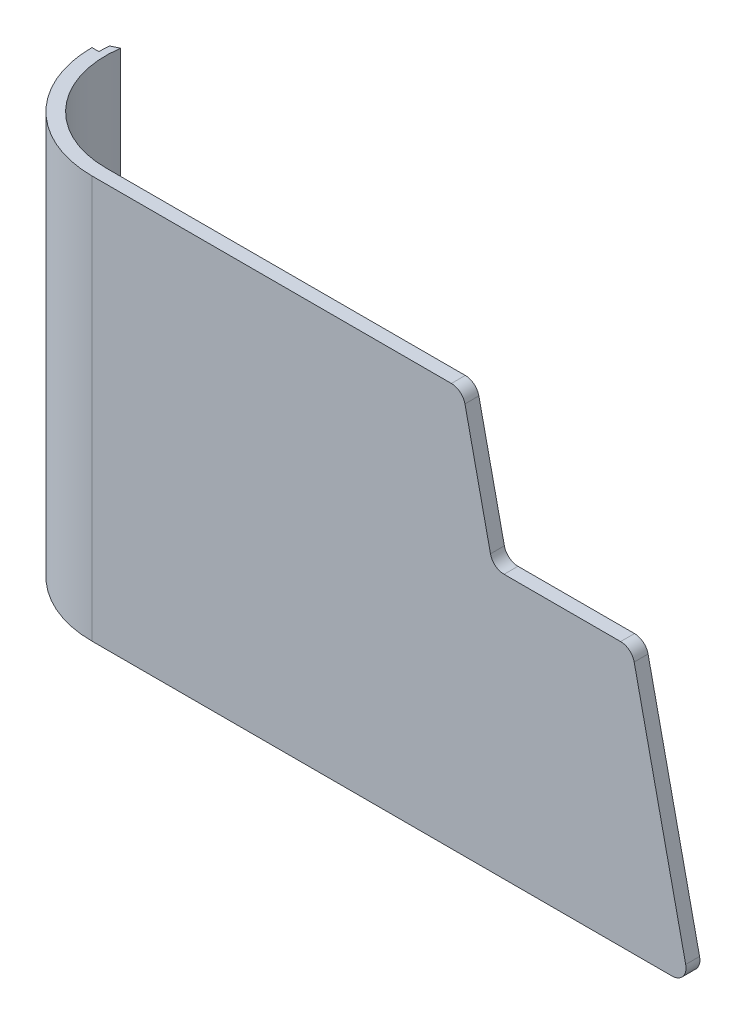
ISO-10303-21;
HEADER;
FILE_DESCRIPTION(('STEP AP214'),'2;1');
FILE_NAME('part.step','',(''),(''),'','','');
FILE_SCHEMA(('AUTOMOTIVE_DESIGN { 1 0 10303 214 1 1 1 1 }'));
ENDSEC;
DATA;
#1=APPLICATION_CONTEXT('core data for automotive mechanical design processes');
#2=APPLICATION_PROTOCOL_DEFINITION('international standard','automotive_design',2000,#1);
#3=PRODUCT_CONTEXT('',#1,'mechanical');
#4=PRODUCT('Part','Part','',(#3));
#5=PRODUCT_RELATED_PRODUCT_CATEGORY('part','',(#4));
#6=PRODUCT_DEFINITION_FORMATION('','',#4);
#7=PRODUCT_DEFINITION_CONTEXT('part definition',#1,'design');
#8=PRODUCT_DEFINITION('design','',#6,#7);
#9=PRODUCT_DEFINITION_SHAPE('','',#8);
#10=(LENGTH_UNIT() NAMED_UNIT(*) SI_UNIT(.MILLI.,.METRE.));
#11=(NAMED_UNIT(*) PLANE_ANGLE_UNIT() SI_UNIT($,.RADIAN.));
#12=(NAMED_UNIT(*) SI_UNIT($,.STERADIAN.) SOLID_ANGLE_UNIT());
#13=UNCERTAINTY_MEASURE_WITH_UNIT(LENGTH_MEASURE(1.E-05),#10,'distance_accuracy_value','');
#14=(GEOMETRIC_REPRESENTATION_CONTEXT(3) GLOBAL_UNCERTAINTY_ASSIGNED_CONTEXT((#13)) GLOBAL_UNIT_ASSIGNED_CONTEXT((#10,
#11,#12)) REPRESENTATION_CONTEXT('',''));
#15=CARTESIAN_POINT('',(0.,0.,0.));
#16=DIRECTION('',(0.,0.,1.));
#17=DIRECTION('',(1.,0.,0.));
#18=AXIS2_PLACEMENT_3D('',#15,#16,#17);
#19=CARTESIAN_POINT('',(-66.,58.,0.));
#20=DIRECTION('',(0.,0.,-1.));
#21=DIRECTION('',(-1.,0.,0.));
#22=AXIS2_PLACEMENT_3D('',#19,#20,#21);
#23=PLANE('',#22);
#24=DIRECTION('',(1.,0.,0.));
#25=VECTOR('',#24,1.);
#26=CARTESIAN_POINT('',(-66.,0.,0.));
#27=LINE('',#26,#25);
#28=CARTESIAN_POINT('',(-66.,0.,0.));
#29=VERTEX_POINT('',#28);
#30=CARTESIAN_POINT('',(-65.,0.,0.));
#31=VERTEX_POINT('',#30);
#32=EDGE_CURVE('E183',#29,#31,#27,.T.);
#33=ORIENTED_EDGE('',*,*,#32,.F.);
#34=DIRECTION('',(0.,-1.,0.));
#35=VECTOR('',#34,1.);
#36=CARTESIAN_POINT('',(-66.,58.,0.));
#37=LINE('',#36,#35);
#38=CARTESIAN_POINT('',(-66.,58.,0.));
#39=VERTEX_POINT('',#38);
#40=EDGE_CURVE('E163',#39,#29,#37,.T.);
#41=ORIENTED_EDGE('',*,*,#40,.F.);
#42=DIRECTION('',(1.,0.,0.));
#43=VECTOR('',#42,1.);
#44=CARTESIAN_POINT('',(-66.,58.,0.));
#45=LINE('',#44,#43);
#46=CARTESIAN_POINT('',(-65.,58.,0.));
#47=VERTEX_POINT('',#46);
#48=EDGE_CURVE('E146',#39,#47,#45,.T.);
#49=ORIENTED_EDGE('',*,*,#48,.T.);
#50=DIRECTION('',(0.,-1.,0.));
#51=VECTOR('',#50,1.);
#52=CARTESIAN_POINT('',(-65.,58.,0.));
#53=LINE('',#52,#51);
#54=EDGE_CURVE('E153',#47,#31,#53,.T.);
#55=ORIENTED_EDGE('',*,*,#54,.T.);
#56=EDGE_LOOP('',(#33,#41,#49,#55));
#57=FACE_BOUND('',#56,.T.);
#58=ADVANCED_FACE('F38',(#57),#23,.T.);
#59=CARTESIAN_POINT('',(-50.,58.,0.));
#60=DIRECTION('',(0.,-1.,0.));
#61=DIRECTION('',(0.,0.,-1.));
#62=AXIS2_PLACEMENT_3D('',#59,#60,#61);
#63=CYLINDRICAL_SURFACE('',#62,16.);
#64=CARTESIAN_POINT('',(-50.,0.,0.));
#65=DIRECTION('',(0.,1.,0.));
#66=DIRECTION('',(0.,0.,1.));
#67=AXIS2_PLACEMENT_3D('',#64,#65,#66);
#68=CIRCLE('',#67,16.);
#69=CARTESIAN_POINT('',(-50.,0.,16.));
#70=VERTEX_POINT('',#69);
#71=EDGE_CURVE('E165',#29,#70,#68,.T.);
#72=ORIENTED_EDGE('',*,*,#71,.T.);
#73=DIRECTION('',(0.,-1.,0.));
#74=VECTOR('',#73,1.);
#75=CARTESIAN_POINT('',(-50.,58.,16.));
#76=LINE('',#75,#74);
#77=CARTESIAN_POINT('',(-50.,58.,16.));
#78=VERTEX_POINT('',#77);
#79=EDGE_CURVE('E198',#78,#70,#76,.T.);
#80=ORIENTED_EDGE('',*,*,#79,.F.);
#81=CARTESIAN_POINT('',(-50.,58.,0.));
#82=DIRECTION('',(0.,1.,0.));
#83=DIRECTION('',(0.,0.,1.));
#84=AXIS2_PLACEMENT_3D('',#81,#82,#83);
#85=CIRCLE('',#84,16.);
#86=EDGE_CURVE('E161',#39,#78,#85,.T.);
#87=ORIENTED_EDGE('',*,*,#86,.F.);
#88=ORIENTED_EDGE('',*,*,#40,.T.);
#89=EDGE_LOOP('',(#72,#80,#87,#88));
#90=FACE_BOUND('',#89,.T.);
#91=ADVANCED_FACE('F280',(#90),#63,.T.);
#92=CARTESIAN_POINT('',(-50.,58.,16.));
#93=DIRECTION('',(0.,0.,-1.));
#94=DIRECTION('',(-1.,0.,0.));
#95=AXIS2_PLACEMENT_3D('',#92,#93,#94);
#96=PLANE('',#95);
#97=DIRECTION('',(0.213030386274981,-0.977045574435263,0.));
#98=VECTOR('',#97,1.);
#99=CARTESIAN_POINT('',(7.71466010362074,38.,16.));
#100=LINE('',#99,#98);
#101=CARTESIAN_POINT('',(3.69712914435977,56.42606077255,16.));
#102=VERTEX_POINT('',#101);
#103=CARTESIAN_POINT('',(7.37148585426105,39.57393922745,16.));
#104=VERTEX_POINT('',#103);
#105=EDGE_CURVE('E242',#102,#104,#100,.T.);
#106=ORIENTED_EDGE('',*,*,#105,.F.);
#107=CARTESIAN_POINT('',(1.74303799548924,56.,16.));
#108=DIRECTION('',(0.,0.,-1.));
#109=DIRECTION('',(-1.,0.,0.));
#110=AXIS2_PLACEMENT_3D('',#107,#108,#109);
#111=CIRCLE('',#110,2.);
#112=CARTESIAN_POINT('',(1.74303799548924,58.,16.));
#113=VERTEX_POINT('',#112);
#114=EDGE_CURVE('E222',#102,#113,#111,.F.);
#115=ORIENTED_EDGE('',*,*,#114,.T.);
#116=DIRECTION('',(1.,0.,0.));
#117=VECTOR('',#116,1.);
#118=CARTESIAN_POINT('',(-50.,58.,16.));
#119=LINE('',#118,#117);
#120=EDGE_CURVE('E180',#78,#113,#119,.T.);
#121=ORIENTED_EDGE('',*,*,#120,.F.);
#122=ORIENTED_EDGE('',*,*,#79,.T.);
#123=DIRECTION('',(1.,0.,0.));
#124=VECTOR('',#123,1.);
#125=CARTESIAN_POINT('',(-50.,0.,16.));
#126=LINE('',#125,#124);
#127=CARTESIAN_POINT('',(33.516942058765,0.,16.));
#128=VERTEX_POINT('',#127);
#129=EDGE_CURVE('E167',#70,#128,#126,.T.);
#130=ORIENTED_EDGE('',*,*,#129,.T.);
#131=CARTESIAN_POINT('',(33.516942058765,2.,16.));
#132=DIRECTION('',(0.,0.,-1.));
#133=DIRECTION('',(-1.,0.,0.));
#134=AXIS2_PLACEMENT_3D('',#131,#132,#133);
#135=CIRCLE('',#134,2.);
#136=CARTESIAN_POINT('',(35.4710332076356,2.42606077254996,16.));
#137=VERTEX_POINT('',#136);
#138=EDGE_CURVE('E218',#128,#137,#135,.F.);
#139=ORIENTED_EDGE('',*,*,#138,.T.);
#140=DIRECTION('',(0.213030386274981,-0.977045574435263,0.));
#141=VECTOR('',#140,1.);
#142=CARTESIAN_POINT('',(36.,0.,16.));
#143=LINE('',#142,#141);
#144=CARTESIAN_POINT('',(28.0578343529804,36.42606077255,16.));
#145=VERTEX_POINT('',#144);
#146=EDGE_CURVE('E267',#145,#137,#143,.T.);
#147=ORIENTED_EDGE('',*,*,#146,.F.);
#148=CARTESIAN_POINT('',(26.1037432041099,36.,16.));
#149=DIRECTION('',(0.,0.,-1.));
#150=DIRECTION('',(-1.,0.,0.));
#151=AXIS2_PLACEMENT_3D('',#148,#149,#150);
#152=CIRCLE('',#151,2.);
#153=CARTESIAN_POINT('',(26.1037432041099,38.,16.));
#154=VERTEX_POINT('',#153);
#155=EDGE_CURVE('E220',#145,#154,#152,.F.);
#156=ORIENTED_EDGE('',*,*,#155,.T.);
#157=DIRECTION('',(1.,0.,0.));
#158=VECTOR('',#157,1.);
#159=CARTESIAN_POINT('',(27.7146601036207,38.,16.));
#160=LINE('',#159,#158);
#161=CARTESIAN_POINT('',(9.32557700313158,38.,16.));
#162=VERTEX_POINT('',#161);
#163=EDGE_CURVE('E244',#162,#154,#160,.T.);
#164=ORIENTED_EDGE('',*,*,#163,.F.);
#165=CARTESIAN_POINT('',(9.32557700313158,40.,16.));
#166=DIRECTION('',(0.,0.,-1.));
#167=DIRECTION('',(-1.,0.,0.));
#168=AXIS2_PLACEMENT_3D('',#165,#166,#167);
#169=CIRCLE('',#168,2.);
#170=EDGE_CURVE('E46',#162,#104,#169,.T.);
#171=ORIENTED_EDGE('',*,*,#170,.T.);
#172=EDGE_LOOP('',(#106,#115,#121,#122,#130,#139,#147,#156,#164,#171));
#173=FACE_BOUND('',#172,.T.);
#174=ADVANCED_FACE('F241',(#173),#96,.F.);
#175=CARTESIAN_POINT('',(-50.,58.,14.));
#176=DIRECTION('',(0.,0.,-1.));
#177=DIRECTION('',(-1.,0.,0.));
#178=AXIS2_PLACEMENT_3D('',#175,#176,#177);
#179=PLANE('',#178);
#180=DIRECTION('',(1.,0.,0.));
#181=VECTOR('',#180,1.);
#182=CARTESIAN_POINT('',(-50.,58.,14.));
#183=LINE('',#182,#181);
#184=CARTESIAN_POINT('',(-50.,58.,14.));
#185=VERTEX_POINT('',#184);
#186=CARTESIAN_POINT('',(1.74303799548924,58.,14.));
#187=VERTEX_POINT('',#186);
#188=EDGE_CURVE('E177',#185,#187,#183,.T.);
#189=ORIENTED_EDGE('',*,*,#188,.T.);
#190=CARTESIAN_POINT('',(1.74303799548924,56.,14.));
#191=DIRECTION('',(0.,0.,-1.));
#192=DIRECTION('',(-1.,0.,0.));
#193=AXIS2_PLACEMENT_3D('',#190,#191,#192);
#194=CIRCLE('',#193,2.);
#195=CARTESIAN_POINT('',(3.69712914435977,56.42606077255,14.));
#196=VERTEX_POINT('',#195);
#197=EDGE_CURVE('E228',#187,#196,#194,.T.);
#198=ORIENTED_EDGE('',*,*,#197,.T.);
#199=DIRECTION('',(-0.213030386274981,0.977045574435263,0.));
#200=VECTOR('',#199,1.);
#201=CARTESIAN_POINT('',(0.932648623001277,69.1051133069584,14.));
#202=LINE('',#201,#200);
#203=CARTESIAN_POINT('',(7.37148585426106,39.57393922745,14.));
#204=VERTEX_POINT('',#203);
#205=EDGE_CURVE('E170',#204,#196,#202,.T.);
#206=ORIENTED_EDGE('',*,*,#205,.F.);
#207=CARTESIAN_POINT('',(9.32557700313158,40.,14.));
#208=DIRECTION('',(0.,0.,-1.));
#209=DIRECTION('',(-1.,0.,0.));
#210=AXIS2_PLACEMENT_3D('',#207,#208,#209);
#211=CIRCLE('',#210,2.);
#212=CARTESIAN_POINT('',(9.32557700313158,38.,14.));
#213=VERTEX_POINT('',#212);
#214=EDGE_CURVE('E11',#204,#213,#211,.F.);
#215=ORIENTED_EDGE('',*,*,#214,.T.);
#216=DIRECTION('',(-1.,0.,0.));
#217=VECTOR('',#216,1.);
#218=CARTESIAN_POINT('',(-50.,38.,14.));
#219=LINE('',#218,#217);
#220=CARTESIAN_POINT('',(26.1037432041099,38.,14.));
#221=VERTEX_POINT('',#220);
#222=EDGE_CURVE('E197',#221,#213,#219,.T.);
#223=ORIENTED_EDGE('',*,*,#222,.F.);
#224=CARTESIAN_POINT('',(26.1037432041099,36.,14.));
#225=DIRECTION('',(0.,0.,-1.));
#226=DIRECTION('',(-1.,0.,0.));
#227=AXIS2_PLACEMENT_3D('',#224,#225,#226);
#228=CIRCLE('',#227,2.);
#229=CARTESIAN_POINT('',(28.0578343529804,36.42606077255,14.));
#230=VERTEX_POINT('',#229);
#231=EDGE_CURVE('E59',#221,#230,#228,.T.);
#232=ORIENTED_EDGE('',*,*,#231,.T.);
#233=DIRECTION('',(-0.213030386274981,0.977045574435263,0.));
#234=VECTOR('',#233,1.);
#235=CARTESIAN_POINT('',(20.0250097134719,73.2679212295625,14.));
#236=LINE('',#235,#234);
#237=CARTESIAN_POINT('',(35.4710332076356,2.42606077254996,14.));
#238=VERTEX_POINT('',#237);
#239=EDGE_CURVE('E269',#238,#230,#236,.T.);
#240=ORIENTED_EDGE('',*,*,#239,.F.);
#241=CARTESIAN_POINT('',(33.516942058765,2.,14.));
#242=DIRECTION('',(0.,0.,-1.));
#243=DIRECTION('',(-1.,0.,0.));
#244=AXIS2_PLACEMENT_3D('',#241,#242,#243);
#245=CIRCLE('',#244,2.);
#246=CARTESIAN_POINT('',(33.516942058765,0.,14.));
#247=VERTEX_POINT('',#246);
#248=EDGE_CURVE('E53',#238,#247,#245,.T.);
#249=ORIENTED_EDGE('',*,*,#248,.T.);
#250=DIRECTION('',(1.,0.,0.));
#251=VECTOR('',#250,1.);
#252=CARTESIAN_POINT('',(-50.,0.,14.));
#253=LINE('',#252,#251);
#254=CARTESIAN_POINT('',(-50.,0.,14.));
#255=VERTEX_POINT('',#254);
#256=EDGE_CURVE('E192',#255,#247,#253,.T.);
#257=ORIENTED_EDGE('',*,*,#256,.F.);
#258=DIRECTION('',(0.,-1.,0.));
#259=VECTOR('',#258,1.);
#260=CARTESIAN_POINT('',(-50.,58.,14.));
#261=LINE('',#260,#259);
#262=EDGE_CURVE('E201',#185,#255,#261,.T.);
#263=ORIENTED_EDGE('',*,*,#262,.F.);
#264=EDGE_LOOP('',(#189,#198,#206,#215,#223,#232,#240,#249,#257,#263));
#265=FACE_BOUND('',#264,.T.);
#266=ADVANCED_FACE('F256',(#265),#179,.T.);
#267=CARTESIAN_POINT('',(-50.,58.,0.));
#268=DIRECTION('',(0.,-1.,0.));
#269=DIRECTION('',(0.,0.,-1.));
#270=AXIS2_PLACEMENT_3D('',#267,#268,#269);
#271=CYLINDRICAL_SURFACE('',#270,14.);
#272=CARTESIAN_POINT('',(-50.,0.,0.));
#273=DIRECTION('',(0.,1.,0.));
#274=DIRECTION('',(0.,0.,1.));
#275=AXIS2_PLACEMENT_3D('',#272,#273,#274);
#276=CIRCLE('',#275,14.);
#277=CARTESIAN_POINT('',(-63.856406460551,0.,-1.99999999999999));
#278=VERTEX_POINT('',#277);
#279=EDGE_CURVE('E189',#278,#255,#276,.T.);
#280=ORIENTED_EDGE('',*,*,#279,.F.);
#281=DIRECTION('',(0.,-1.,0.));
#282=VECTOR('',#281,1.);
#283=CARTESIAN_POINT('',(-63.856406460551,58.,-1.99999999999999));
#284=LINE('',#283,#282);
#285=CARTESIAN_POINT('',(-63.856406460551,58.,-1.99999999999999));
#286=VERTEX_POINT('',#285);
#287=EDGE_CURVE('E203',#286,#278,#284,.T.);
#288=ORIENTED_EDGE('',*,*,#287,.F.);
#289=CARTESIAN_POINT('',(-50.,58.,0.));
#290=DIRECTION('',(0.,1.,0.));
#291=DIRECTION('',(0.,0.,1.));
#292=AXIS2_PLACEMENT_3D('',#289,#290,#291);
#293=CIRCLE('',#292,14.);
#294=EDGE_CURVE('E174',#286,#185,#293,.T.);
#295=ORIENTED_EDGE('',*,*,#294,.T.);
#296=ORIENTED_EDGE('',*,*,#262,.T.);
#297=EDGE_LOOP('',(#280,#288,#295,#296));
#298=FACE_BOUND('',#297,.T.);
#299=ADVANCED_FACE('F385',(#298),#271,.F.);
#300=CARTESIAN_POINT('',(-64.928657628904,58.,-1.4612259917501));
#301=DIRECTION('',(-0.448978340208234,0.,-0.893542640294161));
#302=DIRECTION('',(-0.893542640294161,0.,0.448978340208234));
#303=AXIS2_PLACEMENT_3D('',#300,#301,#302);
#304=PLANE('',#303);
#305=DIRECTION('',(0.893542640294161,0.,-0.448978340208234));
#306=VECTOR('',#305,1.);
#307=CARTESIAN_POINT('',(-64.928657628904,0.,-1.4612259917501));
#308=LINE('',#307,#306);
#309=CARTESIAN_POINT('',(-64.928657628904,0.,-1.4612259917501));
#310=VERTEX_POINT('',#309);
#311=EDGE_CURVE('E186',#310,#278,#308,.T.);
#312=ORIENTED_EDGE('',*,*,#311,.F.);
#313=DIRECTION('',(0.,-1.,0.));
#314=VECTOR('',#313,1.);
#315=CARTESIAN_POINT('',(-64.928657628904,58.,-1.4612259917501));
#316=LINE('',#315,#314);
#317=CARTESIAN_POINT('',(-64.928657628904,58.,-1.4612259917501));
#318=VERTEX_POINT('',#317);
#319=EDGE_CURVE('E160',#318,#310,#316,.T.);
#320=ORIENTED_EDGE('',*,*,#319,.F.);
#321=DIRECTION('',(0.893542640294161,0.,-0.448978340208234));
#322=VECTOR('',#321,1.);
#323=CARTESIAN_POINT('',(-64.928657628904,58.,-1.4612259917501));
#324=LINE('',#323,#322);
#325=EDGE_CURVE('E149',#318,#286,#324,.T.);
#326=ORIENTED_EDGE('',*,*,#325,.T.);
#327=ORIENTED_EDGE('',*,*,#287,.T.);
#328=EDGE_LOOP('',(#312,#320,#326,#327));
#329=FACE_BOUND('',#328,.T.);
#330=ADVANCED_FACE('F377',(#329),#304,.T.);
#331=CARTESIAN_POINT('',(-50.,58.,0.));
#332=DIRECTION('',(0.,-1.,0.));
#333=DIRECTION('',(0.,0.,-1.));
#334=AXIS2_PLACEMENT_3D('',#331,#332,#333);
#335=CYLINDRICAL_SURFACE('',#334,15.);
#336=CARTESIAN_POINT('',(-50.,0.,0.));
#337=DIRECTION('',(0.,1.,0.));
#338=DIRECTION('',(0.,0.,1.));
#339=AXIS2_PLACEMENT_3D('',#336,#337,#338);
#340=CIRCLE('',#339,15.);
#341=EDGE_CURVE('E156',#310,#31,#340,.T.);
#342=ORIENTED_EDGE('',*,*,#341,.T.);
#343=ORIENTED_EDGE('',*,*,#54,.F.);
#344=CARTESIAN_POINT('',(-50.,58.,0.));
#345=DIRECTION('',(0.,1.,0.));
#346=DIRECTION('',(0.,0.,1.));
#347=AXIS2_PLACEMENT_3D('',#344,#345,#346);
#348=CIRCLE('',#347,15.);
#349=EDGE_CURVE('E141',#318,#47,#348,.T.);
#350=ORIENTED_EDGE('',*,*,#349,.F.);
#351=ORIENTED_EDGE('',*,*,#319,.T.);
#352=EDGE_LOOP('',(#342,#343,#350,#351));
#353=FACE_BOUND('',#352,.T.);
#354=ADVANCED_FACE('F154',(#353),#335,.T.);
#355=CARTESIAN_POINT('',(-50.,58.,0.));
#356=DIRECTION('',(0.,1.,0.));
#357=DIRECTION('',(0.,0.,1.));
#358=AXIS2_PLACEMENT_3D('',#355,#356,#357);
#359=PLANE('',#358);
#360=ORIENTED_EDGE('',*,*,#120,.T.);
#361=DIRECTION('',(0.,0.,1.));
#362=VECTOR('',#361,1.);
#363=CARTESIAN_POINT('',(1.74303799548924,58.,14.));
#364=LINE('',#363,#362);
#365=EDGE_CURVE('E224',#113,#187,#364,.F.);
#366=ORIENTED_EDGE('',*,*,#365,.T.);
#367=ORIENTED_EDGE('',*,*,#188,.F.);
#368=ORIENTED_EDGE('',*,*,#294,.F.);
#369=ORIENTED_EDGE('',*,*,#325,.F.);
#370=ORIENTED_EDGE('',*,*,#349,.T.);
#371=ORIENTED_EDGE('',*,*,#48,.F.);
#372=ORIENTED_EDGE('',*,*,#86,.T.);
#373=EDGE_LOOP('',(#360,#366,#367,#368,#369,#370,#371,#372));
#374=FACE_BOUND('',#373,.T.);
#375=ADVANCED_FACE('F144',(#374),#359,.T.);
#376=CARTESIAN_POINT('',(-50.,0.,0.));
#377=DIRECTION('',(0.,1.,0.));
#378=DIRECTION('',(0.,0.,1.));
#379=AXIS2_PLACEMENT_3D('',#376,#377,#378);
#380=PLANE('',#379);
#381=ORIENTED_EDGE('',*,*,#256,.T.);
#382=DIRECTION('',(0.,0.,1.));
#383=VECTOR('',#382,1.);
#384=CARTESIAN_POINT('',(33.516942058765,0.,0.));
#385=LINE('',#384,#383);
#386=EDGE_CURVE('E235',#247,#128,#385,.T.);
#387=ORIENTED_EDGE('',*,*,#386,.T.);
#388=ORIENTED_EDGE('',*,*,#129,.F.);
#389=ORIENTED_EDGE('',*,*,#71,.F.);
#390=ORIENTED_EDGE('',*,*,#32,.T.);
#391=ORIENTED_EDGE('',*,*,#341,.F.);
#392=ORIENTED_EDGE('',*,*,#311,.T.);
#393=ORIENTED_EDGE('',*,*,#279,.T.);
#394=EDGE_LOOP('',(#381,#387,#388,#389,#390,#391,#392,#393));
#395=FACE_BOUND('',#394,.T.);
#396=ADVANCED_FACE('F284',(#395),#380,.F.);
#397=CARTESIAN_POINT('',(36.,0.,-1.99999999999999));
#398=DIRECTION('',(-0.977045574435263,-0.213030386274981,0.));
#399=DIRECTION('',(0.213030386274981,-0.977045574435263,0.));
#400=AXIS2_PLACEMENT_3D('',#397,#398,#399);
#401=PLANE('',#400);
#402=ORIENTED_EDGE('',*,*,#239,.T.);
#403=DIRECTION('',(0.,0.,1.));
#404=VECTOR('',#403,1.);
#405=CARTESIAN_POINT('',(28.0578343529804,36.42606077255,-1.99999999999999));
#406=LINE('',#405,#404);
#407=EDGE_CURVE('E232',#230,#145,#406,.T.);
#408=ORIENTED_EDGE('',*,*,#407,.T.);
#409=ORIENTED_EDGE('',*,*,#146,.T.);
#410=DIRECTION('',(0.,0.,1.));
#411=VECTOR('',#410,1.);
#412=CARTESIAN_POINT('',(35.4710332076356,2.42606077254996,-1.99999999999999));
#413=LINE('',#412,#411);
#414=EDGE_CURVE('E230',#137,#238,#413,.F.);
#415=ORIENTED_EDGE('',*,*,#414,.T.);
#416=EDGE_LOOP('',(#402,#408,#409,#415));
#417=FACE_BOUND('',#416,.T.);
#418=ADVANCED_FACE('F266',(#417),#401,.F.);
#419=CARTESIAN_POINT('',(27.7146601036207,38.,-1.99999999999999));
#420=DIRECTION('',(0.,-1.,0.));
#421=DIRECTION('',(0.,0.,-1.));
#422=AXIS2_PLACEMENT_3D('',#419,#420,#421);
#423=PLANE('',#422);
#424=ORIENTED_EDGE('',*,*,#222,.T.);
#425=DIRECTION('',(0.,0.,1.));
#426=VECTOR('',#425,1.);
#427=CARTESIAN_POINT('',(9.32557700313158,38.,16.));
#428=LINE('',#427,#426);
#429=EDGE_CURVE('E210',#213,#162,#428,.T.);
#430=ORIENTED_EDGE('',*,*,#429,.T.);
#431=ORIENTED_EDGE('',*,*,#163,.T.);
#432=DIRECTION('',(0.,0.,1.));
#433=VECTOR('',#432,1.);
#434=CARTESIAN_POINT('',(26.1037432041099,38.,-1.99999999999999));
#435=LINE('',#434,#433);
#436=EDGE_CURVE('E208',#154,#221,#435,.F.);
#437=ORIENTED_EDGE('',*,*,#436,.T.);
#438=EDGE_LOOP('',(#424,#430,#431,#437));
#439=FACE_BOUND('',#438,.T.);
#440=ADVANCED_FACE('F258',(#439),#423,.F.);
#441=CARTESIAN_POINT('',(7.71466010362074,38.,-1.99999999999999));
#442=DIRECTION('',(-0.977045574435263,-0.213030386274981,0.));
#443=DIRECTION('',(0.213030386274981,-0.977045574435263,0.));
#444=AXIS2_PLACEMENT_3D('',#441,#442,#443);
#445=PLANE('',#444);
#446=ORIENTED_EDGE('',*,*,#105,.T.);
#447=DIRECTION('',(0.,0.,1.));
#448=VECTOR('',#447,1.);
#449=CARTESIAN_POINT('',(7.37148585426105,39.57393922745,14.));
#450=LINE('',#449,#448);
#451=EDGE_CURVE('E216',#104,#204,#450,.F.);
#452=ORIENTED_EDGE('',*,*,#451,.T.);
#453=ORIENTED_EDGE('',*,*,#205,.T.);
#454=DIRECTION('',(0.,0.,1.));
#455=VECTOR('',#454,1.);
#456=CARTESIAN_POINT('',(3.69712914435977,56.42606077255,16.));
#457=LINE('',#456,#455);
#458=EDGE_CURVE('E213',#196,#102,#457,.T.);
#459=ORIENTED_EDGE('',*,*,#458,.T.);
#460=EDGE_LOOP('',(#446,#452,#453,#459));
#461=FACE_BOUND('',#460,.T.);
#462=ADVANCED_FACE('F249',(#461),#445,.F.);
#463=CARTESIAN_POINT('',(9.32557700313158,40.,-1.99999999999999));
#464=DIRECTION('',(0.,0.,-1.));
#465=DIRECTION('',(-1.,0.,0.));
#466=AXIS2_PLACEMENT_3D('',#463,#464,#465);
#467=CYLINDRICAL_SURFACE('',#466,2.);
#468=ORIENTED_EDGE('',*,*,#214,.F.);
#469=ORIENTED_EDGE('',*,*,#451,.F.);
#470=ORIENTED_EDGE('',*,*,#170,.F.);
#471=ORIENTED_EDGE('',*,*,#429,.F.);
#472=EDGE_LOOP('',(#468,#469,#470,#471));
#473=FACE_BOUND('',#472,.T.);
#474=ADVANCED_FACE('F255',(#473),#467,.F.);
#475=CARTESIAN_POINT('',(1.74303799548924,56.,-1.99999999999999));
#476=DIRECTION('',(0.,0.,-1.));
#477=DIRECTION('',(-1.,0.,0.));
#478=AXIS2_PLACEMENT_3D('',#475,#476,#477);
#479=CYLINDRICAL_SURFACE('',#478,2.);
#480=ORIENTED_EDGE('',*,*,#197,.F.);
#481=ORIENTED_EDGE('',*,*,#365,.F.);
#482=ORIENTED_EDGE('',*,*,#114,.F.);
#483=ORIENTED_EDGE('',*,*,#458,.F.);
#484=EDGE_LOOP('',(#480,#481,#482,#483));
#485=FACE_BOUND('',#484,.T.);
#486=ADVANCED_FACE('F274',(#485),#479,.T.);
#487=CARTESIAN_POINT('',(26.1037432041099,36.,-1.99999999999999));
#488=DIRECTION('',(0.,0.,1.));
#489=DIRECTION('',(1.,0.,0.));
#490=AXIS2_PLACEMENT_3D('',#487,#488,#489);
#491=CYLINDRICAL_SURFACE('',#490,2.);
#492=ORIENTED_EDGE('',*,*,#231,.F.);
#493=ORIENTED_EDGE('',*,*,#436,.F.);
#494=ORIENTED_EDGE('',*,*,#155,.F.);
#495=ORIENTED_EDGE('',*,*,#407,.F.);
#496=EDGE_LOOP('',(#492,#493,#494,#495));
#497=FACE_BOUND('',#496,.T.);
#498=ADVANCED_FACE('F261',(#497),#491,.T.);
#499=CARTESIAN_POINT('',(33.516942058765,2.,0.));
#500=DIRECTION('',(0.,0.,1.));
#501=DIRECTION('',(1.,0.,0.));
#502=AXIS2_PLACEMENT_3D('',#499,#500,#501);
#503=CYLINDRICAL_SURFACE('',#502,2.);
#504=ORIENTED_EDGE('',*,*,#248,.F.);
#505=ORIENTED_EDGE('',*,*,#414,.F.);
#506=ORIENTED_EDGE('',*,*,#138,.F.);
#507=ORIENTED_EDGE('',*,*,#386,.F.);
#508=EDGE_LOOP('',(#504,#505,#506,#507));
#509=FACE_BOUND('',#508,.T.);
#510=ADVANCED_FACE('F40',(#509),#503,.T.);
#511=CLOSED_SHELL('',(#58,#91,#174,#266,#299,#330,#354,#375,#396,#418,#440,#462,#474,#486,#498,#510));
#512=MANIFOLD_SOLID_BREP('B2',#511);
#513=ADVANCED_BREP_SHAPE_REPRESENTATION('',(#18,#512),#14);
#514=SHAPE_DEFINITION_REPRESENTATION(#9,#513);
ENDSEC;
END-ISO-10303-21;
